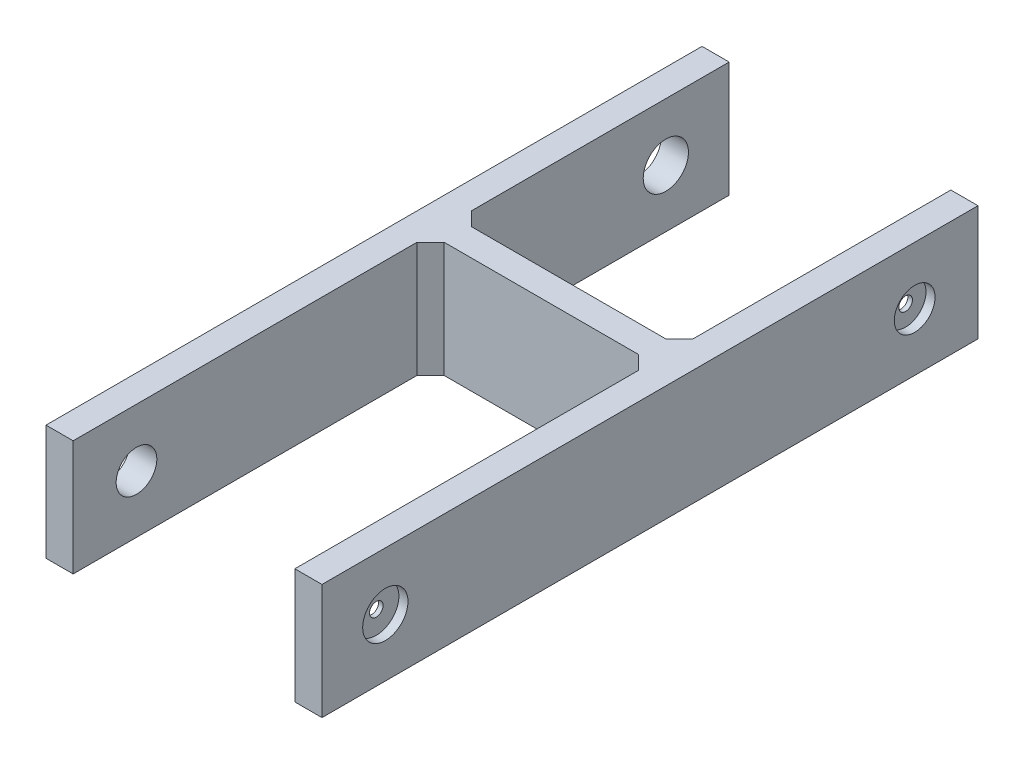
ISO-10303-21;
HEADER;
FILE_DESCRIPTION(('STEP AP214'),'2;1');
FILE_NAME('part.step','',(''),(''),'','','');
FILE_SCHEMA(('AUTOMOTIVE_DESIGN { 1 0 10303 214 1 1 1 1 }'));
ENDSEC;
DATA;
#1=APPLICATION_CONTEXT('core data for automotive mechanical design processes');
#2=APPLICATION_PROTOCOL_DEFINITION('international standard','automotive_design',2000,#1);
#3=PRODUCT_CONTEXT('',#1,'mechanical');
#4=PRODUCT('Part','Part','',(#3));
#5=PRODUCT_RELATED_PRODUCT_CATEGORY('part','',(#4));
#6=PRODUCT_DEFINITION_FORMATION('','',#4);
#7=PRODUCT_DEFINITION_CONTEXT('part definition',#1,'design');
#8=PRODUCT_DEFINITION('design','',#6,#7);
#9=PRODUCT_DEFINITION_SHAPE('','',#8);
#10=(LENGTH_UNIT() NAMED_UNIT(*) SI_UNIT(.MILLI.,.METRE.));
#11=(NAMED_UNIT(*) PLANE_ANGLE_UNIT() SI_UNIT($,.RADIAN.));
#12=(NAMED_UNIT(*) SI_UNIT($,.STERADIAN.) SOLID_ANGLE_UNIT());
#13=UNCERTAINTY_MEASURE_WITH_UNIT(LENGTH_MEASURE(1.E-05),#10,'distance_accuracy_value','');
#14=(GEOMETRIC_REPRESENTATION_CONTEXT(3) GLOBAL_UNCERTAINTY_ASSIGNED_CONTEXT((#13)) GLOBAL_UNIT_ASSIGNED_CONTEXT((#10,
#11,#12)) REPRESENTATION_CONTEXT('',''));
#15=CARTESIAN_POINT('',(0.,0.,0.));
#16=DIRECTION('',(0.,0.,1.));
#17=DIRECTION('',(1.,0.,0.));
#18=AXIS2_PLACEMENT_3D('',#15,#16,#17);
#19=CARTESIAN_POINT('',(65.,12.75,71.));
#20=DIRECTION('',(-1.,0.,0.));
#21=DIRECTION('',(0.,0.,1.));
#22=AXIS2_PLACEMENT_3D('',#19,#20,#21);
#23=CYLINDRICAL_SURFACE('',#22,1.5);
#24=CARTESIAN_POINT('',(58.,12.75,71.));
#25=DIRECTION('',(1.,0.,0.));
#26=DIRECTION('',(0.,0.,-1.));
#27=AXIS2_PLACEMENT_3D('',#24,#25,#26);
#28=CIRCLE('',#27,1.5);
#29=CARTESIAN_POINT('',(58.,12.75,69.5));
#30=VERTEX_POINT('',#29);
#31=EDGE_CURVE('E298',#30,#30,#28,.F.);
#32=ORIENTED_EDGE('',*,*,#31,.T.);
#33=EDGE_LOOP('',(#32));
#34=FACE_BOUND('',#33,.T.);
#35=CARTESIAN_POINT('',(59.,12.75,71.));
#36=DIRECTION('',(1.,0.,0.));
#37=DIRECTION('',(0.,0.,-1.));
#38=AXIS2_PLACEMENT_3D('',#35,#36,#37);
#39=CIRCLE('',#38,1.5);
#40=CARTESIAN_POINT('',(59.,12.75,69.5));
#41=VERTEX_POINT('',#40);
#42=EDGE_CURVE('E312',#41,#41,#39,.F.);
#43=ORIENTED_EDGE('',*,*,#42,.F.);
#44=EDGE_LOOP('',(#43));
#45=FACE_BOUND('',#44,.T.);
#46=ADVANCED_FACE('F41',(#34,#45),#23,.F.);
#47=CARTESIAN_POINT('',(6.00000000000002,25.5,85.));
#48=DIRECTION('',(-1.,0.,0.));
#49=DIRECTION('',(0.,0.,1.));
#50=AXIS2_PLACEMENT_3D('',#47,#48,#49);
#51=PLANE('',#50);
#52=CARTESIAN_POINT('',(6.,12.75,71.));
#53=DIRECTION('',(1.,0.,0.));
#54=DIRECTION('',(0.,0.,-1.));
#55=AXIS2_PLACEMENT_3D('',#52,#53,#54);
#56=CIRCLE('',#55,4.5);
#57=CARTESIAN_POINT('',(6.,12.75,66.5));
#58=VERTEX_POINT('',#57);
#59=EDGE_CURVE('E317',#58,#58,#56,.T.);
#60=ORIENTED_EDGE('',*,*,#59,.F.);
#61=EDGE_LOOP('',(#60));
#62=FACE_BOUND('',#61,.T.);
#63=DIRECTION('',(0.,0.,-1.));
#64=VECTOR('',#63,1.);
#65=CARTESIAN_POINT('',(6.00000000000002,0.,85.));
#66=LINE('',#65,#64);
#67=CARTESIAN_POINT('',(6.00000000000002,0.,85.));
#68=VERTEX_POINT('',#67);
#69=CARTESIAN_POINT('',(6.00000000000001,0.,9.00000000000002));
#70=VERTEX_POINT('',#69);
#71=EDGE_CURVE('E361',#68,#70,#66,.T.);
#72=ORIENTED_EDGE('',*,*,#71,.T.);
#73=DIRECTION('',(0.,1.,0.));
#74=VECTOR('',#73,1.);
#75=CARTESIAN_POINT('',(6.00000000000001,-4.24264068711929,9.00000000000001));
#76=LINE('',#75,#74);
#77=CARTESIAN_POINT('',(6.00000000000001,25.5,9.00000000000002));
#78=VERTEX_POINT('',#77);
#79=EDGE_CURVE('E538',#70,#78,#76,.T.);
#80=ORIENTED_EDGE('',*,*,#79,.T.);
#81=DIRECTION('',(0.,0.,-1.));
#82=VECTOR('',#81,1.);
#83=CARTESIAN_POINT('',(6.00000000000002,25.5,85.));
#84=LINE('',#83,#82);
#85=CARTESIAN_POINT('',(6.00000000000002,25.5,85.));
#86=VERTEX_POINT('',#85);
#87=EDGE_CURVE('E322',#86,#78,#84,.T.);
#88=ORIENTED_EDGE('',*,*,#87,.F.);
#89=DIRECTION('',(0.,-1.,0.));
#90=VECTOR('',#89,1.);
#91=CARTESIAN_POINT('',(6.00000000000002,25.5,85.));
#92=LINE('',#91,#90);
#93=EDGE_CURVE('E360',#86,#68,#92,.T.);
#94=ORIENTED_EDGE('',*,*,#93,.T.);
#95=EDGE_LOOP('',(#72,#80,#88,#94));
#96=FACE_BOUND('',#95,.T.);
#97=ADVANCED_FACE('F43',(#62,#96),#51,.F.);
#98=CARTESIAN_POINT('',(6.00000000000001,25.5,6.00000000000001));
#99=DIRECTION('',(0.,0.,-1.));
#100=DIRECTION('',(-1.,0.,0.));
#101=AXIS2_PLACEMENT_3D('',#98,#99,#100);
#102=PLANE('',#101);
#103=DIRECTION('',(1.,0.,0.));
#104=VECTOR('',#103,1.);
#105=CARTESIAN_POINT('',(6.00000000000001,0.,6.00000000000001));
#106=LINE('',#105,#104);
#107=CARTESIAN_POINT('',(9.00000000000001,0.,6.00000000000001));
#108=VERTEX_POINT('',#107);
#109=CARTESIAN_POINT('',(52.,0.,6.00000000000001));
#110=VERTEX_POINT('',#109);
#111=EDGE_CURVE('E364',#108,#110,#106,.T.);
#112=ORIENTED_EDGE('',*,*,#111,.T.);
#113=DIRECTION('',(0.,1.,0.));
#114=VECTOR('',#113,1.);
#115=CARTESIAN_POINT('',(52.,-4.24264068711929,5.99999999999998));
#116=LINE('',#115,#114);
#117=CARTESIAN_POINT('',(52.,25.5,6.00000000000001));
#118=VERTEX_POINT('',#117);
#119=EDGE_CURVE('E67',#110,#118,#116,.T.);
#120=ORIENTED_EDGE('',*,*,#119,.T.);
#121=DIRECTION('',(1.,0.,0.));
#122=VECTOR('',#121,1.);
#123=CARTESIAN_POINT('',(6.00000000000001,25.5,6.00000000000001));
#124=LINE('',#123,#122);
#125=CARTESIAN_POINT('',(9.00000000000001,25.5,6.00000000000001));
#126=VERTEX_POINT('',#125);
#127=EDGE_CURVE('E326',#126,#118,#124,.T.);
#128=ORIENTED_EDGE('',*,*,#127,.F.);
#129=DIRECTION('',(0.,1.,0.));
#130=VECTOR('',#129,1.);
#131=CARTESIAN_POINT('',(9.00000000000001,-4.24264068711929,6.00000000000001));
#132=LINE('',#131,#130);
#133=EDGE_CURVE('E517',#108,#126,#132,.T.);
#134=ORIENTED_EDGE('',*,*,#133,.F.);
#135=EDGE_LOOP('',(#112,#120,#128,#134));
#136=FACE_BOUND('',#135,.T.);
#137=ADVANCED_FACE('F456',(#136),#102,.F.);
#138=CARTESIAN_POINT('',(55.,25.5,6.00000000000001));
#139=DIRECTION('',(1.,0.,0.));
#140=DIRECTION('',(0.,0.,-1.));
#141=AXIS2_PLACEMENT_3D('',#138,#139,#140);
#142=PLANE('',#141);
#143=DIRECTION('',(0.,-0.201652920670486,-0.979457043256652));
#144=VECTOR('',#143,1.);
#145=CARTESIAN_POINT('',(55.,19.25,71.));
#146=LINE('',#145,#144);
#147=CARTESIAN_POINT('',(55.,19.25,71.));
#148=VERTEX_POINT('',#147);
#149=CARTESIAN_POINT('',(55.,15.75,54.));
#150=VERTEX_POINT('',#149);
#151=EDGE_CURVE('E284',#148,#150,#146,.T.);
#152=ORIENTED_EDGE('',*,*,#151,.F.);
#153=CARTESIAN_POINT('',(55.,12.75,71.));
#154=DIRECTION('',(-1.,0.,0.));
#155=DIRECTION('',(0.,0.,-1.));
#156=AXIS2_PLACEMENT_3D('',#153,#154,#155);
#157=CIRCLE('',#156,6.49999999999999);
#158=CARTESIAN_POINT('',(55.,6.24999999999999,71.));
#159=VERTEX_POINT('',#158);
#160=EDGE_CURVE('E258',#159,#148,#157,.T.);
#161=ORIENTED_EDGE('',*,*,#160,.F.);
#162=DIRECTION('',(0.,-0.201652920670488,0.979457043256652));
#163=VECTOR('',#162,1.);
#164=CARTESIAN_POINT('',(55.,9.75,54.));
#165=LINE('',#164,#163);
#166=CARTESIAN_POINT('',(55.,9.75,54.));
#167=VERTEX_POINT('',#166);
#168=EDGE_CURVE('E269',#167,#159,#165,.T.);
#169=ORIENTED_EDGE('',*,*,#168,.F.);
#170=CARTESIAN_POINT('',(55.,12.75,54.));
#171=DIRECTION('',(-1.,0.,0.));
#172=DIRECTION('',(0.,0.,1.));
#173=AXIS2_PLACEMENT_3D('',#170,#171,#172);
#174=CIRCLE('',#173,3.);
#175=EDGE_CURVE('E288',#150,#167,#174,.T.);
#176=ORIENTED_EDGE('',*,*,#175,.F.);
#177=EDGE_LOOP('',(#152,#161,#169,#176));
#178=FACE_BOUND('',#177,.T.);
#179=DIRECTION('',(0.,0.,1.));
#180=VECTOR('',#179,1.);
#181=CARTESIAN_POINT('',(55.,25.5,6.00000000000001));
#182=LINE('',#181,#180);
#183=CARTESIAN_POINT('',(55.,25.5,8.99999999999998));
#184=VERTEX_POINT('',#183);
#185=CARTESIAN_POINT('',(55.,25.5,85.));
#186=VERTEX_POINT('',#185);
#187=EDGE_CURVE('E59',#184,#186,#182,.T.);
#188=ORIENTED_EDGE('',*,*,#187,.F.);
#189=DIRECTION('',(0.,1.,0.));
#190=VECTOR('',#189,1.);
#191=CARTESIAN_POINT('',(55.,-4.24264068711929,8.99999999999998));
#192=LINE('',#191,#190);
#193=CARTESIAN_POINT('',(55.,0.,8.99999999999998));
#194=VERTEX_POINT('',#193);
#195=EDGE_CURVE('E526',#194,#184,#192,.T.);
#196=ORIENTED_EDGE('',*,*,#195,.F.);
#197=DIRECTION('',(0.,0.,1.));
#198=VECTOR('',#197,1.);
#199=CARTESIAN_POINT('',(55.,0.,6.00000000000001));
#200=LINE('',#199,#198);
#201=CARTESIAN_POINT('',(55.,0.,85.));
#202=VERTEX_POINT('',#201);
#203=EDGE_CURVE('E367',#194,#202,#200,.T.);
#204=ORIENTED_EDGE('',*,*,#203,.T.);
#205=DIRECTION('',(0.,-1.,0.));
#206=VECTOR('',#205,1.);
#207=CARTESIAN_POINT('',(55.,25.5,85.));
#208=LINE('',#207,#206);
#209=EDGE_CURVE('E11',#186,#202,#208,.T.);
#210=ORIENTED_EDGE('',*,*,#209,.F.);
#211=EDGE_LOOP('',(#188,#196,#204,#210));
#212=FACE_BOUND('',#211,.T.);
#213=ADVANCED_FACE('F507',(#178,#212),#142,.F.);
#214=CARTESIAN_POINT('',(55.,25.5,85.));
#215=DIRECTION('',(0.,0.,-1.));
#216=DIRECTION('',(-1.,0.,0.));
#217=AXIS2_PLACEMENT_3D('',#214,#215,#216);
#218=PLANE('',#217);
#219=DIRECTION('',(1.,0.,0.));
#220=VECTOR('',#219,1.);
#221=CARTESIAN_POINT('',(55.,0.,85.));
#222=LINE('',#221,#220);
#223=CARTESIAN_POINT('',(61.,0.,85.));
#224=VERTEX_POINT('',#223);
#225=EDGE_CURVE('E370',#202,#224,#222,.T.);
#226=ORIENTED_EDGE('',*,*,#225,.T.);
#227=DIRECTION('',(0.,-1.,0.));
#228=VECTOR('',#227,1.);
#229=CARTESIAN_POINT('',(61.,25.5,85.));
#230=LINE('',#229,#228);
#231=CARTESIAN_POINT('',(61.,25.5,85.));
#232=VERTEX_POINT('',#231);
#233=EDGE_CURVE('E51',#232,#224,#230,.T.);
#234=ORIENTED_EDGE('',*,*,#233,.F.);
#235=DIRECTION('',(1.,0.,0.));
#236=VECTOR('',#235,1.);
#237=CARTESIAN_POINT('',(55.,25.5,85.));
#238=LINE('',#237,#236);
#239=EDGE_CURVE('E332',#186,#232,#238,.T.);
#240=ORIENTED_EDGE('',*,*,#239,.F.);
#241=ORIENTED_EDGE('',*,*,#209,.T.);
#242=EDGE_LOOP('',(#226,#234,#240,#241));
#243=FACE_BOUND('',#242,.T.);
#244=ADVANCED_FACE('F503',(#243),#218,.F.);
#245=CARTESIAN_POINT('',(61.,25.5,85.));
#246=DIRECTION('',(-1.,0.,0.));
#247=DIRECTION('',(0.,0.,1.));
#248=AXIS2_PLACEMENT_3D('',#245,#246,#247);
#249=PLANE('',#248);
#250=CARTESIAN_POINT('',(61.,12.75,-46.));
#251=DIRECTION('',(1.,0.,0.));
#252=DIRECTION('',(0.,0.,-1.));
#253=AXIS2_PLACEMENT_3D('',#250,#251,#252);
#254=CIRCLE('',#253,4.5);
#255=CARTESIAN_POINT('',(61.,12.75,-50.5));
#256=VERTEX_POINT('',#255);
#257=EDGE_CURVE('E239',#256,#256,#254,.T.);
#258=ORIENTED_EDGE('',*,*,#257,.F.);
#259=EDGE_LOOP('',(#258));
#260=FACE_BOUND('',#259,.T.);
#261=CARTESIAN_POINT('',(61.,12.75,71.));
#262=DIRECTION('',(1.,0.,0.));
#263=DIRECTION('',(0.,0.,-1.));
#264=AXIS2_PLACEMENT_3D('',#261,#262,#263);
#265=CIRCLE('',#264,5.);
#266=CARTESIAN_POINT('',(61.,12.75,66.));
#267=VERTEX_POINT('',#266);
#268=EDGE_CURVE('E313',#267,#267,#265,.T.);
#269=ORIENTED_EDGE('',*,*,#268,.F.);
#270=EDGE_LOOP('',(#269));
#271=FACE_BOUND('',#270,.T.);
#272=DIRECTION('',(0.,0.,-1.));
#273=VECTOR('',#272,1.);
#274=CARTESIAN_POINT('',(61.,0.,85.));
#275=LINE('',#274,#273);
#276=CARTESIAN_POINT('',(61.,0.,-60.));
#277=VERTEX_POINT('',#276);
#278=EDGE_CURVE('E373',#224,#277,#275,.T.);
#279=ORIENTED_EDGE('',*,*,#278,.T.);
#280=DIRECTION('',(0.,-1.,0.));
#281=VECTOR('',#280,1.);
#282=CARTESIAN_POINT('',(61.,25.5,-60.));
#283=LINE('',#282,#281);
#284=CARTESIAN_POINT('',(61.,25.5,-60.));
#285=VERTEX_POINT('',#284);
#286=EDGE_CURVE('E415',#285,#277,#283,.T.);
#287=ORIENTED_EDGE('',*,*,#286,.F.);
#288=DIRECTION('',(0.,0.,-1.));
#289=VECTOR('',#288,1.);
#290=CARTESIAN_POINT('',(61.,25.5,85.));
#291=LINE('',#290,#289);
#292=EDGE_CURVE('E335',#232,#285,#291,.T.);
#293=ORIENTED_EDGE('',*,*,#292,.F.);
#294=ORIENTED_EDGE('',*,*,#233,.T.);
#295=EDGE_LOOP('',(#279,#287,#293,#294));
#296=FACE_BOUND('',#295,.T.);
#297=ADVANCED_FACE('F499',(#260,#271,#296),#249,.F.);
#298=CARTESIAN_POINT('',(55.,25.5,-60.));
#299=DIRECTION('',(0.,0.,1.));
#300=DIRECTION('',(1.,0.,0.));
#301=AXIS2_PLACEMENT_3D('',#298,#299,#300);
#302=PLANE('',#301);
#303=DIRECTION('',(-1.,0.,0.));
#304=VECTOR('',#303,1.);
#305=CARTESIAN_POINT('',(55.,0.,-60.));
#306=LINE('',#305,#304);
#307=CARTESIAN_POINT('',(55.,0.,-60.));
#308=VERTEX_POINT('',#307);
#309=EDGE_CURVE('E376',#277,#308,#306,.T.);
#310=ORIENTED_EDGE('',*,*,#309,.T.);
#311=DIRECTION('',(0.,-1.,0.));
#312=VECTOR('',#311,1.);
#313=CARTESIAN_POINT('',(55.,25.5,-60.));
#314=LINE('',#313,#312);
#315=CARTESIAN_POINT('',(55.,25.5,-60.));
#316=VERTEX_POINT('',#315);
#317=EDGE_CURVE('E411',#316,#308,#314,.T.);
#318=ORIENTED_EDGE('',*,*,#317,.F.);
#319=DIRECTION('',(-1.,0.,0.));
#320=VECTOR('',#319,1.);
#321=CARTESIAN_POINT('',(55.,25.5,-60.));
#322=LINE('',#321,#320);
#323=EDGE_CURVE('E338',#285,#316,#322,.T.);
#324=ORIENTED_EDGE('',*,*,#323,.F.);
#325=ORIENTED_EDGE('',*,*,#286,.T.);
#326=EDGE_LOOP('',(#310,#318,#324,#325));
#327=FACE_BOUND('',#326,.T.);
#328=ADVANCED_FACE('F495',(#327),#302,.F.);
#329=CARTESIAN_POINT('',(55.,25.5,0.));
#330=DIRECTION('',(1.,0.,0.));
#331=DIRECTION('',(0.,0.,-1.));
#332=AXIS2_PLACEMENT_3D('',#329,#330,#331);
#333=PLANE('',#332);
#334=DIRECTION('',(0.,0.201652920670488,-0.979457043256652));
#335=VECTOR('',#334,1.);
#336=CARTESIAN_POINT('',(55.,19.25,-46.));
#337=LINE('',#336,#335);
#338=CARTESIAN_POINT('',(55.,15.75,-29.));
#339=VERTEX_POINT('',#338);
#340=CARTESIAN_POINT('',(55.,19.25,-46.));
#341=VERTEX_POINT('',#340);
#342=EDGE_CURVE('E248',#339,#341,#337,.T.);
#343=ORIENTED_EDGE('',*,*,#342,.F.);
#344=CARTESIAN_POINT('',(55.,12.75,-29.));
#345=DIRECTION('',(-1.,0.,0.));
#346=DIRECTION('',(0.,0.,-1.));
#347=AXIS2_PLACEMENT_3D('',#344,#345,#346);
#348=CIRCLE('',#347,3.);
#349=CARTESIAN_POINT('',(55.,9.75,-29.));
#350=VERTEX_POINT('',#349);
#351=EDGE_CURVE('E212',#350,#339,#348,.T.);
#352=ORIENTED_EDGE('',*,*,#351,.F.);
#353=DIRECTION('',(0.,0.201652920670488,0.979457043256651));
#354=VECTOR('',#353,1.);
#355=CARTESIAN_POINT('',(55.,9.75,-29.));
#356=LINE('',#355,#354);
#357=CARTESIAN_POINT('',(55.,6.24999999999999,-46.));
#358=VERTEX_POINT('',#357);
#359=EDGE_CURVE('E232',#358,#350,#356,.T.);
#360=ORIENTED_EDGE('',*,*,#359,.F.);
#361=CARTESIAN_POINT('',(55.,12.75,-46.));
#362=DIRECTION('',(-1.,0.,0.));
#363=DIRECTION('',(0.,0.,1.));
#364=AXIS2_PLACEMENT_3D('',#361,#362,#363);
#365=CIRCLE('',#364,6.50000000000001);
#366=EDGE_CURVE('E236',#341,#358,#365,.T.);
#367=ORIENTED_EDGE('',*,*,#366,.F.);
#368=EDGE_LOOP('',(#343,#352,#360,#367));
#369=FACE_BOUND('',#368,.T.);
#370=DIRECTION('',(0.,0.,1.));
#371=VECTOR('',#370,1.);
#372=CARTESIAN_POINT('',(55.,0.,0.));
#373=LINE('',#372,#371);
#374=CARTESIAN_POINT('',(55.,0.,-3.00000000000004));
#375=VERTEX_POINT('',#374);
#376=EDGE_CURVE('E379',#308,#375,#373,.T.);
#377=ORIENTED_EDGE('',*,*,#376,.T.);
#378=DIRECTION('',(0.,1.,0.));
#379=VECTOR('',#378,1.);
#380=CARTESIAN_POINT('',(55.,-4.24264068711929,-3.00000000000003));
#381=LINE('',#380,#379);
#382=CARTESIAN_POINT('',(55.,25.5,-3.00000000000004));
#383=VERTEX_POINT('',#382);
#384=EDGE_CURVE('E553',#375,#383,#381,.T.);
#385=ORIENTED_EDGE('',*,*,#384,.T.);
#386=DIRECTION('',(0.,0.,1.));
#387=VECTOR('',#386,1.);
#388=CARTESIAN_POINT('',(55.,25.5,0.));
#389=LINE('',#388,#387);
#390=EDGE_CURVE('E341',#316,#383,#389,.T.);
#391=ORIENTED_EDGE('',*,*,#390,.F.);
#392=ORIENTED_EDGE('',*,*,#317,.T.);
#393=EDGE_LOOP('',(#377,#385,#391,#392));
#394=FACE_BOUND('',#393,.T.);
#395=ADVANCED_FACE('F491',(#369,#394),#333,.F.);
#396=CARTESIAN_POINT('',(6.00000000000001,25.5,0.));
#397=DIRECTION('',(0.,0.,1.));
#398=DIRECTION('',(1.,0.,0.));
#399=AXIS2_PLACEMENT_3D('',#396,#397,#398);
#400=PLANE('',#399);
#401=DIRECTION('',(-1.,0.,0.));
#402=VECTOR('',#401,1.);
#403=CARTESIAN_POINT('',(6.00000000000001,25.5,0.));
#404=LINE('',#403,#402);
#405=CARTESIAN_POINT('',(52.,25.5,0.));
#406=VERTEX_POINT('',#405);
#407=CARTESIAN_POINT('',(9.00000000000001,25.5,0.));
#408=VERTEX_POINT('',#407);
#409=EDGE_CURVE('E345',#406,#408,#404,.T.);
#410=ORIENTED_EDGE('',*,*,#409,.F.);
#411=DIRECTION('',(0.,1.,0.));
#412=VECTOR('',#411,1.);
#413=CARTESIAN_POINT('',(52.,-4.24264068711929,0.));
#414=LINE('',#413,#412);
#415=CARTESIAN_POINT('',(52.,0.,0.));
#416=VERTEX_POINT('',#415);
#417=EDGE_CURVE('E558',#416,#406,#414,.T.);
#418=ORIENTED_EDGE('',*,*,#417,.F.);
#419=DIRECTION('',(-1.,0.,0.));
#420=VECTOR('',#419,1.);
#421=CARTESIAN_POINT('',(6.00000000000001,0.,0.));
#422=LINE('',#421,#420);
#423=CARTESIAN_POINT('',(9.00000000000001,0.,0.));
#424=VERTEX_POINT('',#423);
#425=EDGE_CURVE('E382',#416,#424,#422,.T.);
#426=ORIENTED_EDGE('',*,*,#425,.T.);
#427=DIRECTION('',(0.,1.,0.));
#428=VECTOR('',#427,1.);
#429=CARTESIAN_POINT('',(9.00000000000001,-4.24264068711929,0.));
#430=LINE('',#429,#428);
#431=EDGE_CURVE('E576',#424,#408,#430,.T.);
#432=ORIENTED_EDGE('',*,*,#431,.T.);
#433=EDGE_LOOP('',(#410,#418,#426,#432));
#434=FACE_BOUND('',#433,.T.);
#435=ADVANCED_FACE('F487',(#434),#400,.F.);
#436=CARTESIAN_POINT('',(6.,25.5,-60.));
#437=DIRECTION('',(-1.,0.,0.));
#438=DIRECTION('',(0.,0.,1.));
#439=AXIS2_PLACEMENT_3D('',#436,#437,#438);
#440=PLANE('',#439);
#441=CARTESIAN_POINT('',(6.00000000000001,12.75,-46.));
#442=DIRECTION('',(-1.,0.,0.));
#443=DIRECTION('',(0.,0.,1.));
#444=AXIS2_PLACEMENT_3D('',#441,#442,#443);
#445=CIRCLE('',#444,5.);
#446=CARTESIAN_POINT('',(6.00000000000001,12.75,-41.));
#447=VERTEX_POINT('',#446);
#448=EDGE_CURVE('E584',#447,#447,#445,.T.);
#449=ORIENTED_EDGE('',*,*,#448,.T.);
#450=EDGE_LOOP('',(#449));
#451=FACE_BOUND('',#450,.T.);
#452=DIRECTION('',(0.,0.,-1.));
#453=VECTOR('',#452,1.);
#454=CARTESIAN_POINT('',(6.,25.5,-60.));
#455=LINE('',#454,#453);
#456=CARTESIAN_POINT('',(6.00000000000001,25.5,-3.));
#457=VERTEX_POINT('',#456);
#458=CARTESIAN_POINT('',(6.,25.5,-60.));
#459=VERTEX_POINT('',#458);
#460=EDGE_CURVE('E348',#457,#459,#455,.T.);
#461=ORIENTED_EDGE('',*,*,#460,.F.);
#462=DIRECTION('',(0.,1.,0.));
#463=VECTOR('',#462,1.);
#464=CARTESIAN_POINT('',(6.00000000000001,-4.24264068711929,-3.));
#465=LINE('',#464,#463);
#466=CARTESIAN_POINT('',(6.00000000000001,0.,-3.));
#467=VERTEX_POINT('',#466);
#468=EDGE_CURVE('E572',#467,#457,#465,.T.);
#469=ORIENTED_EDGE('',*,*,#468,.F.);
#470=DIRECTION('',(0.,0.,-1.));
#471=VECTOR('',#470,1.);
#472=CARTESIAN_POINT('',(6.,0.,-60.));
#473=LINE('',#472,#471);
#474=CARTESIAN_POINT('',(6.,0.,-60.));
#475=VERTEX_POINT('',#474);
#476=EDGE_CURVE('E385',#467,#475,#473,.T.);
#477=ORIENTED_EDGE('',*,*,#476,.T.);
#478=DIRECTION('',(0.,-1.,0.));
#479=VECTOR('',#478,1.);
#480=CARTESIAN_POINT('',(6.,25.5,-60.));
#481=LINE('',#480,#479);
#482=EDGE_CURVE('E407',#459,#475,#481,.T.);
#483=ORIENTED_EDGE('',*,*,#482,.F.);
#484=EDGE_LOOP('',(#461,#469,#477,#483));
#485=FACE_BOUND('',#484,.T.);
#486=ADVANCED_FACE('F483',(#451,#485),#440,.F.);
#487=CARTESIAN_POINT('',(0.,25.5,-60.));
#488=DIRECTION('',(0.,0.,1.));
#489=DIRECTION('',(1.,0.,0.));
#490=AXIS2_PLACEMENT_3D('',#487,#488,#489);
#491=PLANE('',#490);
#492=DIRECTION('',(-1.,0.,0.));
#493=VECTOR('',#492,1.);
#494=CARTESIAN_POINT('',(0.,0.,-60.));
#495=LINE('',#494,#493);
#496=CARTESIAN_POINT('',(0.,0.,-60.));
#497=VERTEX_POINT('',#496);
#498=EDGE_CURVE('E388',#475,#497,#495,.T.);
#499=ORIENTED_EDGE('',*,*,#498,.T.);
#500=DIRECTION('',(0.,-1.,0.));
#501=VECTOR('',#500,1.);
#502=CARTESIAN_POINT('',(0.,25.5,-60.));
#503=LINE('',#502,#501);
#504=CARTESIAN_POINT('',(0.,25.5,-60.));
#505=VERTEX_POINT('',#504);
#506=EDGE_CURVE('E403',#505,#497,#503,.T.);
#507=ORIENTED_EDGE('',*,*,#506,.F.);
#508=DIRECTION('',(-1.,0.,0.));
#509=VECTOR('',#508,1.);
#510=CARTESIAN_POINT('',(0.,25.5,-60.));
#511=LINE('',#510,#509);
#512=EDGE_CURVE('E351',#459,#505,#511,.T.);
#513=ORIENTED_EDGE('',*,*,#512,.F.);
#514=ORIENTED_EDGE('',*,*,#482,.T.);
#515=EDGE_LOOP('',(#499,#507,#513,#514));
#516=FACE_BOUND('',#515,.T.);
#517=ADVANCED_FACE('F479',(#516),#491,.F.);
#518=CARTESIAN_POINT('',(0.,25.5,-60.));
#519=DIRECTION('',(1.,0.,0.));
#520=DIRECTION('',(0.,0.,-1.));
#521=AXIS2_PLACEMENT_3D('',#518,#519,#520);
#522=PLANE('',#521);
#523=CARTESIAN_POINT('',(0.,12.75,-46.));
#524=DIRECTION('',(-1.,0.,0.));
#525=DIRECTION('',(0.,0.,1.));
#526=AXIS2_PLACEMENT_3D('',#523,#524,#525);
#527=CIRCLE('',#526,5.);
#528=CARTESIAN_POINT('',(0.,12.75,-41.));
#529=VERTEX_POINT('',#528);
#530=EDGE_CURVE('E580',#529,#529,#527,.T.);
#531=ORIENTED_EDGE('',*,*,#530,.F.);
#532=EDGE_LOOP('',(#531));
#533=FACE_BOUND('',#532,.T.);
#534=CARTESIAN_POINT('',(0.,12.75,71.));
#535=DIRECTION('',(1.,0.,0.));
#536=DIRECTION('',(0.,0.,-1.));
#537=AXIS2_PLACEMENT_3D('',#534,#535,#536);
#538=CIRCLE('',#537,4.5);
#539=CARTESIAN_POINT('',(0.,12.75,66.5));
#540=VERTEX_POINT('',#539);
#541=EDGE_CURVE('E321',#540,#540,#538,.T.);
#542=ORIENTED_EDGE('',*,*,#541,.T.);
#543=EDGE_LOOP('',(#542));
#544=FACE_BOUND('',#543,.T.);
#545=DIRECTION('',(0.,0.,1.));
#546=VECTOR('',#545,1.);
#547=CARTESIAN_POINT('',(0.,0.,-60.));
#548=LINE('',#547,#546);
#549=CARTESIAN_POINT('',(0.,0.,85.));
#550=VERTEX_POINT('',#549);
#551=EDGE_CURVE('E391',#497,#550,#548,.T.);
#552=ORIENTED_EDGE('',*,*,#551,.T.);
#553=DIRECTION('',(0.,-1.,0.));
#554=VECTOR('',#553,1.);
#555=CARTESIAN_POINT('',(0.,25.5,85.));
#556=LINE('',#555,#554);
#557=CARTESIAN_POINT('',(0.,25.5,85.));
#558=VERTEX_POINT('',#557);
#559=EDGE_CURVE('E399',#558,#550,#556,.T.);
#560=ORIENTED_EDGE('',*,*,#559,.F.);
#561=DIRECTION('',(0.,0.,1.));
#562=VECTOR('',#561,1.);
#563=CARTESIAN_POINT('',(0.,25.5,-60.));
#564=LINE('',#563,#562);
#565=EDGE_CURVE('E354',#505,#558,#564,.T.);
#566=ORIENTED_EDGE('',*,*,#565,.F.);
#567=ORIENTED_EDGE('',*,*,#506,.T.);
#568=EDGE_LOOP('',(#552,#560,#566,#567));
#569=FACE_BOUND('',#568,.T.);
#570=ADVANCED_FACE('F475',(#533,#544,#569),#522,.F.);
#571=CARTESIAN_POINT('',(0.,25.5,85.));
#572=DIRECTION('',(0.,0.,-1.));
#573=DIRECTION('',(-1.,0.,0.));
#574=AXIS2_PLACEMENT_3D('',#571,#572,#573);
#575=PLANE('',#574);
#576=DIRECTION('',(1.,0.,0.));
#577=VECTOR('',#576,1.);
#578=CARTESIAN_POINT('',(0.,0.,85.));
#579=LINE('',#578,#577);
#580=EDGE_CURVE('E327',#550,#68,#579,.T.);
#581=ORIENTED_EDGE('',*,*,#580,.T.);
#582=ORIENTED_EDGE('',*,*,#93,.F.);
#583=DIRECTION('',(1.,0.,0.));
#584=VECTOR('',#583,1.);
#585=CARTESIAN_POINT('',(0.,25.5,85.));
#586=LINE('',#585,#584);
#587=EDGE_CURVE('E357',#558,#86,#586,.T.);
#588=ORIENTED_EDGE('',*,*,#587,.F.);
#589=ORIENTED_EDGE('',*,*,#559,.T.);
#590=EDGE_LOOP('',(#581,#582,#588,#589));
#591=FACE_BOUND('',#590,.T.);
#592=ADVANCED_FACE('F468',(#591),#575,.F.);
#593=CARTESIAN_POINT('',(0.,25.5,0.));
#594=DIRECTION('',(0.,-1.,0.));
#595=DIRECTION('',(0.,0.,-1.));
#596=AXIS2_PLACEMENT_3D('',#593,#594,#595);
#597=PLANE('',#596);
#598=DIRECTION('',(0.707106781186548,0.,0.707106781186547));
#599=VECTOR('',#598,1.);
#600=CARTESIAN_POINT('',(55.,25.5,8.99999999999998));
#601=LINE('',#600,#599);
#602=EDGE_CURVE('E527',#118,#184,#601,.T.);
#603=ORIENTED_EDGE('',*,*,#602,.T.);
#604=ORIENTED_EDGE('',*,*,#187,.T.);
#605=ORIENTED_EDGE('',*,*,#239,.T.);
#606=ORIENTED_EDGE('',*,*,#292,.T.);
#607=ORIENTED_EDGE('',*,*,#323,.T.);
#608=ORIENTED_EDGE('',*,*,#390,.T.);
#609=DIRECTION('',(-0.707106781186545,0.,0.70710678118655));
#610=VECTOR('',#609,1.);
#611=CARTESIAN_POINT('',(55.,25.5,-3.00000000000003));
#612=LINE('',#611,#610);
#613=EDGE_CURVE('E549',#383,#406,#612,.T.);
#614=ORIENTED_EDGE('',*,*,#613,.T.);
#615=ORIENTED_EDGE('',*,*,#409,.T.);
#616=DIRECTION('',(-0.707106781186547,0.,-0.707106781186548));
#617=VECTOR('',#616,1.);
#618=CARTESIAN_POINT('',(6.00000000000001,25.5,-3.));
#619=LINE('',#618,#617);
#620=EDGE_CURVE('E564',#408,#457,#619,.T.);
#621=ORIENTED_EDGE('',*,*,#620,.T.);
#622=ORIENTED_EDGE('',*,*,#460,.T.);
#623=ORIENTED_EDGE('',*,*,#512,.T.);
#624=ORIENTED_EDGE('',*,*,#565,.T.);
#625=ORIENTED_EDGE('',*,*,#587,.T.);
#626=ORIENTED_EDGE('',*,*,#87,.T.);
#627=DIRECTION('',(0.707106781186547,0.,-0.707106781186548));
#628=VECTOR('',#627,1.);
#629=CARTESIAN_POINT('',(6.00000000000001,25.5,9.00000000000001));
#630=LINE('',#629,#628);
#631=EDGE_CURVE('E533',#78,#126,#630,.T.);
#632=ORIENTED_EDGE('',*,*,#631,.T.);
#633=ORIENTED_EDGE('',*,*,#127,.T.);
#634=EDGE_LOOP('',(#603,#604,#605,#606,#607,#608,#614,#615,#621,#622,#623,#624,#625,#626,#632,#633));
#635=FACE_BOUND('',#634,.T.);
#636=ADVANCED_FACE('F465',(#635),#597,.F.);
#637=CARTESIAN_POINT('',(0.,0.,0.));
#638=DIRECTION('',(0.,-1.,0.));
#639=DIRECTION('',(0.,0.,-1.));
#640=AXIS2_PLACEMENT_3D('',#637,#638,#639);
#641=PLANE('',#640);
#642=ORIENTED_EDGE('',*,*,#203,.F.);
#643=DIRECTION('',(0.707106781186548,0.,0.707106781186547));
#644=VECTOR('',#643,1.);
#645=CARTESIAN_POINT('',(55.,0.,8.99999999999998));
#646=LINE('',#645,#644);
#647=EDGE_CURVE('E522',#110,#194,#646,.T.);
#648=ORIENTED_EDGE('',*,*,#647,.F.);
#649=ORIENTED_EDGE('',*,*,#111,.F.);
#650=DIRECTION('',(0.707106781186547,0.,-0.707106781186548));
#651=VECTOR('',#650,1.);
#652=CARTESIAN_POINT('',(6.00000000000001,0.,9.00000000000001));
#653=LINE('',#652,#651);
#654=EDGE_CURVE('E542',#70,#108,#653,.T.);
#655=ORIENTED_EDGE('',*,*,#654,.F.);
#656=ORIENTED_EDGE('',*,*,#71,.F.);
#657=ORIENTED_EDGE('',*,*,#580,.F.);
#658=ORIENTED_EDGE('',*,*,#551,.F.);
#659=ORIENTED_EDGE('',*,*,#498,.F.);
#660=ORIENTED_EDGE('',*,*,#476,.F.);
#661=DIRECTION('',(-0.707106781186547,0.,-0.707106781186548));
#662=VECTOR('',#661,1.);
#663=CARTESIAN_POINT('',(6.00000000000001,0.,-3.));
#664=LINE('',#663,#662);
#665=EDGE_CURVE('E568',#424,#467,#664,.T.);
#666=ORIENTED_EDGE('',*,*,#665,.F.);
#667=ORIENTED_EDGE('',*,*,#425,.F.);
#668=DIRECTION('',(-0.707106781186545,0.,0.70710678118655));
#669=VECTOR('',#668,1.);
#670=CARTESIAN_POINT('',(55.,0.,-3.00000000000003));
#671=LINE('',#670,#669);
#672=EDGE_CURVE('E554',#375,#416,#671,.T.);
#673=ORIENTED_EDGE('',*,*,#672,.F.);
#674=ORIENTED_EDGE('',*,*,#376,.F.);
#675=ORIENTED_EDGE('',*,*,#309,.F.);
#676=ORIENTED_EDGE('',*,*,#278,.F.);
#677=ORIENTED_EDGE('',*,*,#225,.F.);
#678=EDGE_LOOP('',(#642,#648,#649,#655,#656,#657,#658,#659,#660,#666,#667,#673,#674,#675,#676,#677));
#679=FACE_BOUND('',#678,.T.);
#680=ADVANCED_FACE('F463',(#679),#641,.T.);
#681=CARTESIAN_POINT('',(-19.,12.75,71.));
#682=DIRECTION('',(1.,0.,0.));
#683=DIRECTION('',(0.,0.,-1.));
#684=AXIS2_PLACEMENT_3D('',#681,#682,#683);
#685=CYLINDRICAL_SURFACE('',#684,4.5);
#686=ORIENTED_EDGE('',*,*,#59,.T.);
#687=EDGE_LOOP('',(#686));
#688=FACE_BOUND('',#687,.T.);
#689=ORIENTED_EDGE('',*,*,#541,.F.);
#690=EDGE_LOOP('',(#689));
#691=FACE_BOUND('',#690,.T.);
#692=ADVANCED_FACE('F460',(#688,#691),#685,.F.);
#693=CARTESIAN_POINT('',(59.,12.75,71.));
#694=DIRECTION('',(1.,0.,0.));
#695=DIRECTION('',(0.,0.,-1.));
#696=AXIS2_PLACEMENT_3D('',#693,#694,#695);
#697=PLANE('',#696);
#698=CARTESIAN_POINT('',(59.,12.75,71.));
#699=DIRECTION('',(1.,0.,0.));
#700=DIRECTION('',(0.,0.,-1.));
#701=AXIS2_PLACEMENT_3D('',#698,#699,#700);
#702=CIRCLE('',#701,5.);
#703=CARTESIAN_POINT('',(59.,12.75,66.));
#704=VERTEX_POINT('',#703);
#705=EDGE_CURVE('E308',#704,#704,#702,.T.);
#706=ORIENTED_EDGE('',*,*,#705,.T.);
#707=EDGE_LOOP('',(#706));
#708=FACE_BOUND('',#707,.T.);
#709=ORIENTED_EDGE('',*,*,#42,.T.);
#710=EDGE_LOOP('',(#709));
#711=FACE_BOUND('',#710,.T.);
#712=ADVANCED_FACE('F446',(#708,#711),#697,.T.);
#713=CARTESIAN_POINT('',(59.,12.75,71.));
#714=DIRECTION('',(1.,0.,0.));
#715=DIRECTION('',(0.,0.,-1.));
#716=AXIS2_PLACEMENT_3D('',#713,#714,#715);
#717=CYLINDRICAL_SURFACE('',#716,5.);
#718=ORIENTED_EDGE('',*,*,#705,.F.);
#719=EDGE_LOOP('',(#718));
#720=FACE_BOUND('',#719,.T.);
#721=ORIENTED_EDGE('',*,*,#268,.T.);
#722=EDGE_LOOP('',(#721));
#723=FACE_BOUND('',#722,.T.);
#724=ADVANCED_FACE('F436',(#720,#723),#717,.F.);
#725=CARTESIAN_POINT('',(58.,12.75,71.));
#726=DIRECTION('',(1.,0.,0.));
#727=DIRECTION('',(0.,0.,-1.));
#728=AXIS2_PLACEMENT_3D('',#725,#726,#727);
#729=PLANE('',#728);
#730=CARTESIAN_POINT('',(58.,12.75,71.));
#731=DIRECTION('',(-1.,0.,0.));
#732=DIRECTION('',(0.,0.,-1.));
#733=AXIS2_PLACEMENT_3D('',#730,#731,#732);
#734=CIRCLE('',#733,6.49999999999999);
#735=CARTESIAN_POINT('',(58.,6.24999999999999,71.));
#736=VERTEX_POINT('',#735);
#737=CARTESIAN_POINT('',(58.,19.25,71.));
#738=VERTEX_POINT('',#737);
#739=EDGE_CURVE('E264',#736,#738,#734,.T.);
#740=ORIENTED_EDGE('',*,*,#739,.T.);
#741=DIRECTION('',(0.,-0.201652920670486,-0.979457043256652));
#742=VECTOR('',#741,1.);
#743=CARTESIAN_POINT('',(58.,19.25,71.));
#744=LINE('',#743,#742);
#745=CARTESIAN_POINT('',(58.,15.75,54.));
#746=VERTEX_POINT('',#745);
#747=EDGE_CURVE('E268',#738,#746,#744,.T.);
#748=ORIENTED_EDGE('',*,*,#747,.T.);
#749=CARTESIAN_POINT('',(58.,12.75,54.));
#750=DIRECTION('',(-1.,0.,0.));
#751=DIRECTION('',(0.,0.,1.));
#752=AXIS2_PLACEMENT_3D('',#749,#750,#751);
#753=CIRCLE('',#752,3.);
#754=CARTESIAN_POINT('',(58.,9.75,54.));
#755=VERTEX_POINT('',#754);
#756=EDGE_CURVE('E273',#746,#755,#753,.T.);
#757=ORIENTED_EDGE('',*,*,#756,.T.);
#758=DIRECTION('',(0.,-0.201652920670488,0.979457043256652));
#759=VECTOR('',#758,1.);
#760=CARTESIAN_POINT('',(58.,9.75,54.));
#761=LINE('',#760,#759);
#762=EDGE_CURVE('E277',#755,#736,#761,.T.);
#763=ORIENTED_EDGE('',*,*,#762,.T.);
#764=EDGE_LOOP('',(#740,#748,#757,#763));
#765=FACE_BOUND('',#764,.T.);
#766=ORIENTED_EDGE('',*,*,#31,.F.);
#767=EDGE_LOOP('',(#766));
#768=FACE_BOUND('',#767,.T.);
#769=ADVANCED_FACE('F433',(#765,#768),#729,.F.);
#770=CARTESIAN_POINT('',(58.,12.75,71.));
#771=DIRECTION('',(-1.,0.,0.));
#772=DIRECTION('',(0.,0.,1.));
#773=AXIS2_PLACEMENT_3D('',#770,#771,#772);
#774=CYLINDRICAL_SURFACE('',#773,6.49999999999999);
#775=ORIENTED_EDGE('',*,*,#160,.T.);
#776=DIRECTION('',(-1.,0.,0.));
#777=VECTOR('',#776,1.);
#778=CARTESIAN_POINT('',(58.,19.25,71.));
#779=LINE('',#778,#777);
#780=EDGE_CURVE('E281',#738,#148,#779,.T.);
#781=ORIENTED_EDGE('',*,*,#780,.F.);
#782=ORIENTED_EDGE('',*,*,#739,.F.);
#783=DIRECTION('',(-1.,0.,0.));
#784=VECTOR('',#783,1.);
#785=CARTESIAN_POINT('',(58.,6.24999999999999,71.));
#786=LINE('',#785,#784);
#787=EDGE_CURVE('E295',#736,#159,#786,.T.);
#788=ORIENTED_EDGE('',*,*,#787,.T.);
#789=EDGE_LOOP('',(#775,#781,#782,#788));
#790=FACE_BOUND('',#789,.T.);
#791=ADVANCED_FACE('F435',(#790),#774,.F.);
#792=CARTESIAN_POINT('',(58.,9.75,54.));
#793=DIRECTION('',(0.,-0.979457043256651,-0.201652920670488));
#794=DIRECTION('',(0.,0.201652920670488,-0.979457043256652));
#795=AXIS2_PLACEMENT_3D('',#792,#793,#794);
#796=PLANE('',#795);
#797=ORIENTED_EDGE('',*,*,#168,.T.);
#798=ORIENTED_EDGE('',*,*,#787,.F.);
#799=ORIENTED_EDGE('',*,*,#762,.F.);
#800=DIRECTION('',(-1.,0.,0.));
#801=VECTOR('',#800,1.);
#802=CARTESIAN_POINT('',(58.,9.75,54.));
#803=LINE('',#802,#801);
#804=EDGE_CURVE('E299',#755,#167,#803,.T.);
#805=ORIENTED_EDGE('',*,*,#804,.T.);
#806=EDGE_LOOP('',(#797,#798,#799,#805));
#807=FACE_BOUND('',#806,.T.);
#808=ADVANCED_FACE('F443',(#807),#796,.F.);
#809=CARTESIAN_POINT('',(58.,12.75,54.));
#810=DIRECTION('',(-1.,0.,0.));
#811=DIRECTION('',(0.,0.,1.));
#812=AXIS2_PLACEMENT_3D('',#809,#810,#811);
#813=CYLINDRICAL_SURFACE('',#812,3.);
#814=ORIENTED_EDGE('',*,*,#175,.T.);
#815=ORIENTED_EDGE('',*,*,#804,.F.);
#816=ORIENTED_EDGE('',*,*,#756,.F.);
#817=DIRECTION('',(-1.,0.,0.));
#818=VECTOR('',#817,1.);
#819=CARTESIAN_POINT('',(58.,15.75,54.));
#820=LINE('',#819,#818);
#821=EDGE_CURVE('E302',#746,#150,#820,.T.);
#822=ORIENTED_EDGE('',*,*,#821,.T.);
#823=EDGE_LOOP('',(#814,#815,#816,#822));
#824=FACE_BOUND('',#823,.T.);
#825=ADVANCED_FACE('F690',(#824),#813,.F.);
#826=CARTESIAN_POINT('',(58.,19.25,71.));
#827=DIRECTION('',(0.,0.979457043256652,-0.201652920670485));
#828=DIRECTION('',(0.,0.201652920670485,0.979457043256652));
#829=AXIS2_PLACEMENT_3D('',#826,#827,#828);
#830=PLANE('',#829);
#831=ORIENTED_EDGE('',*,*,#151,.T.);
#832=ORIENTED_EDGE('',*,*,#821,.F.);
#833=ORIENTED_EDGE('',*,*,#747,.F.);
#834=ORIENTED_EDGE('',*,*,#780,.T.);
#835=EDGE_LOOP('',(#831,#832,#833,#834));
#836=FACE_BOUND('',#835,.T.);
#837=ADVANCED_FACE('F686',(#836),#830,.F.);
#838=CARTESIAN_POINT('',(58.,12.75,-29.));
#839=DIRECTION('',(-1.,0.,0.));
#840=DIRECTION('',(0.,0.,1.));
#841=AXIS2_PLACEMENT_3D('',#838,#839,#840);
#842=CYLINDRICAL_SURFACE('',#841,3.);
#843=ORIENTED_EDGE('',*,*,#351,.T.);
#844=DIRECTION('',(-1.,0.,0.));
#845=VECTOR('',#844,1.);
#846=CARTESIAN_POINT('',(58.,15.75,-29.));
#847=LINE('',#846,#845);
#848=CARTESIAN_POINT('',(58.,15.75,-29.));
#849=VERTEX_POINT('',#848);
#850=EDGE_CURVE('E205',#849,#339,#847,.T.);
#851=ORIENTED_EDGE('',*,*,#850,.F.);
#852=CARTESIAN_POINT('',(58.,12.75,-29.));
#853=DIRECTION('',(-1.,0.,0.));
#854=DIRECTION('',(0.,0.,-1.));
#855=AXIS2_PLACEMENT_3D('',#852,#853,#854);
#856=CIRCLE('',#855,3.);
#857=CARTESIAN_POINT('',(58.,9.75,-29.));
#858=VERTEX_POINT('',#857);
#859=EDGE_CURVE('E209',#858,#849,#856,.T.);
#860=ORIENTED_EDGE('',*,*,#859,.F.);
#861=DIRECTION('',(-1.,0.,0.));
#862=VECTOR('',#861,1.);
#863=CARTESIAN_POINT('',(58.,9.75,-29.));
#864=LINE('',#863,#862);
#865=EDGE_CURVE('E255',#858,#350,#864,.T.);
#866=ORIENTED_EDGE('',*,*,#865,.T.);
#867=EDGE_LOOP('',(#843,#851,#860,#866));
#868=FACE_BOUND('',#867,.T.);
#869=ADVANCED_FACE('F207',(#868),#842,.F.);
#870=CARTESIAN_POINT('',(58.,9.75,-29.));
#871=DIRECTION('',(0.,-0.979457043256651,0.201652920670488));
#872=DIRECTION('',(0.,-0.201652920670488,-0.979457043256652));
#873=AXIS2_PLACEMENT_3D('',#870,#871,#872);
#874=PLANE('',#873);
#875=ORIENTED_EDGE('',*,*,#359,.T.);
#876=ORIENTED_EDGE('',*,*,#865,.F.);
#877=DIRECTION('',(0.,0.201652920670488,0.979457043256651));
#878=VECTOR('',#877,1.);
#879=CARTESIAN_POINT('',(58.,9.75,-29.));
#880=LINE('',#879,#878);
#881=CARTESIAN_POINT('',(58.,6.24999999999999,-46.));
#882=VERTEX_POINT('',#881);
#883=EDGE_CURVE('E218',#882,#858,#880,.T.);
#884=ORIENTED_EDGE('',*,*,#883,.F.);
#885=DIRECTION('',(-1.,0.,0.));
#886=VECTOR('',#885,1.);
#887=CARTESIAN_POINT('',(58.,6.24999999999999,-46.));
#888=LINE('',#887,#886);
#889=EDGE_CURVE('E259',#882,#358,#888,.T.);
#890=ORIENTED_EDGE('',*,*,#889,.T.);
#891=EDGE_LOOP('',(#875,#876,#884,#890));
#892=FACE_BOUND('',#891,.T.);
#893=ADVANCED_FACE('F676',(#892),#874,.F.);
#894=CARTESIAN_POINT('',(58.,12.75,-46.));
#895=DIRECTION('',(-1.,0.,0.));
#896=DIRECTION('',(0.,0.,1.));
#897=AXIS2_PLACEMENT_3D('',#894,#895,#896);
#898=CYLINDRICAL_SURFACE('',#897,6.50000000000001);
#899=ORIENTED_EDGE('',*,*,#366,.T.);
#900=ORIENTED_EDGE('',*,*,#889,.F.);
#901=CARTESIAN_POINT('',(58.,12.75,-46.));
#902=DIRECTION('',(-1.,0.,0.));
#903=DIRECTION('',(0.,0.,1.));
#904=AXIS2_PLACEMENT_3D('',#901,#902,#903);
#905=CIRCLE('',#904,6.50000000000001);
#906=CARTESIAN_POINT('',(58.,19.25,-46.));
#907=VERTEX_POINT('',#906);
#908=EDGE_CURVE('E227',#907,#882,#905,.T.);
#909=ORIENTED_EDGE('',*,*,#908,.F.);
#910=DIRECTION('',(-1.,0.,0.));
#911=VECTOR('',#910,1.);
#912=CARTESIAN_POINT('',(58.,19.25,-46.));
#913=LINE('',#912,#911);
#914=EDGE_CURVE('E217',#907,#341,#913,.T.);
#915=ORIENTED_EDGE('',*,*,#914,.T.);
#916=EDGE_LOOP('',(#899,#900,#909,#915));
#917=FACE_BOUND('',#916,.T.);
#918=ADVANCED_FACE('F679',(#917),#898,.F.);
#919=CARTESIAN_POINT('',(58.,19.25,-46.));
#920=DIRECTION('',(0.,0.979457043256651,0.201652920670488));
#921=DIRECTION('',(0.,-0.201652920670488,0.979457043256652));
#922=AXIS2_PLACEMENT_3D('',#919,#920,#921);
#923=PLANE('',#922);
#924=ORIENTED_EDGE('',*,*,#342,.T.);
#925=ORIENTED_EDGE('',*,*,#914,.F.);
#926=DIRECTION('',(0.,0.201652920670488,-0.979457043256652));
#927=VECTOR('',#926,1.);
#928=CARTESIAN_POINT('',(58.,19.25,-46.));
#929=LINE('',#928,#927);
#930=EDGE_CURVE('E221',#849,#907,#929,.T.);
#931=ORIENTED_EDGE('',*,*,#930,.F.);
#932=ORIENTED_EDGE('',*,*,#850,.T.);
#933=EDGE_LOOP('',(#924,#925,#931,#932));
#934=FACE_BOUND('',#933,.T.);
#935=ADVANCED_FACE('F222',(#934),#923,.F.);
#936=CARTESIAN_POINT('',(58.,12.75,-29.));
#937=DIRECTION('',(1.,0.,0.));
#938=DIRECTION('',(0.,0.,-1.));
#939=AXIS2_PLACEMENT_3D('',#936,#937,#938);
#940=PLANE('',#939);
#941=CARTESIAN_POINT('',(58.,12.75,-46.));
#942=DIRECTION('',(1.,0.,0.));
#943=DIRECTION('',(0.,0.,-1.));
#944=AXIS2_PLACEMENT_3D('',#941,#942,#943);
#945=CIRCLE('',#944,1.5);
#946=CARTESIAN_POINT('',(58.,12.75,-47.5));
#947=VERTEX_POINT('',#946);
#948=EDGE_CURVE('E588',#947,#947,#945,.T.);
#949=ORIENTED_EDGE('',*,*,#948,.T.);
#950=EDGE_LOOP('',(#949));
#951=FACE_BOUND('',#950,.T.);
#952=ORIENTED_EDGE('',*,*,#859,.T.);
#953=ORIENTED_EDGE('',*,*,#930,.T.);
#954=ORIENTED_EDGE('',*,*,#908,.T.);
#955=ORIENTED_EDGE('',*,*,#883,.T.);
#956=EDGE_LOOP('',(#952,#953,#954,#955));
#957=FACE_BOUND('',#956,.T.);
#958=ADVANCED_FACE('F229',(#951,#957),#940,.F.);
#959=CARTESIAN_POINT('',(59.,12.75,-46.));
#960=DIRECTION('',(1.,0.,0.));
#961=DIRECTION('',(0.,0.,-1.));
#962=AXIS2_PLACEMENT_3D('',#959,#960,#961);
#963=CYLINDRICAL_SURFACE('',#962,4.5);
#964=CARTESIAN_POINT('',(59.,12.75,-46.));
#965=DIRECTION('',(1.,0.,0.));
#966=DIRECTION('',(0.,0.,-1.));
#967=AXIS2_PLACEMENT_3D('',#964,#965,#966);
#968=CIRCLE('',#967,4.5);
#969=CARTESIAN_POINT('',(59.,12.75,-50.5));
#970=VERTEX_POINT('',#969);
#971=EDGE_CURVE('E249',#970,#970,#968,.T.);
#972=ORIENTED_EDGE('',*,*,#971,.F.);
#973=EDGE_LOOP('',(#972));
#974=FACE_BOUND('',#973,.T.);
#975=ORIENTED_EDGE('',*,*,#257,.T.);
#976=EDGE_LOOP('',(#975));
#977=FACE_BOUND('',#976,.T.);
#978=ADVANCED_FACE('F599',(#974,#977),#963,.F.);
#979=CARTESIAN_POINT('',(59.,12.75,-46.));
#980=DIRECTION('',(1.,0.,0.));
#981=DIRECTION('',(0.,0.,-1.));
#982=AXIS2_PLACEMENT_3D('',#979,#980,#981);
#983=PLANE('',#982);
#984=CARTESIAN_POINT('',(59.,12.75,-46.));
#985=DIRECTION('',(1.,0.,0.));
#986=DIRECTION('',(0.,0.,-1.));
#987=AXIS2_PLACEMENT_3D('',#984,#985,#986);
#988=CIRCLE('',#987,1.5);
#989=CARTESIAN_POINT('',(59.,12.75,-47.5));
#990=VERTEX_POINT('',#989);
#991=EDGE_CURVE('E45',#990,#990,#988,.T.);
#992=ORIENTED_EDGE('',*,*,#991,.F.);
#993=EDGE_LOOP('',(#992));
#994=FACE_BOUND('',#993,.T.);
#995=ORIENTED_EDGE('',*,*,#971,.T.);
#996=EDGE_LOOP('',(#995));
#997=FACE_BOUND('',#996,.T.);
#998=ADVANCED_FACE('F665',(#994,#997),#983,.T.);
#999=CARTESIAN_POINT('',(0.,12.75,-46.));
#1000=DIRECTION('',(1.,0.,0.));
#1001=DIRECTION('',(0.,0.,-1.));
#1002=AXIS2_PLACEMENT_3D('',#999,#1000,#1001);
#1003=CYLINDRICAL_SURFACE('',#1002,1.5);
#1004=ORIENTED_EDGE('',*,*,#991,.T.);
#1005=EDGE_LOOP('',(#1004));
#1006=FACE_BOUND('',#1005,.T.);
#1007=ORIENTED_EDGE('',*,*,#948,.F.);
#1008=EDGE_LOOP('',(#1007));
#1009=FACE_BOUND('',#1008,.T.);
#1010=ADVANCED_FACE('F661',(#1006,#1009),#1003,.F.);
#1011=CARTESIAN_POINT('',(10.,12.75,-46.));
#1012=DIRECTION('',(-1.,0.,0.));
#1013=DIRECTION('',(0.,0.,1.));
#1014=AXIS2_PLACEMENT_3D('',#1011,#1012,#1013);
#1015=CYLINDRICAL_SURFACE('',#1014,5.);
#1016=ORIENTED_EDGE('',*,*,#530,.T.);
#1017=EDGE_LOOP('',(#1016));
#1018=FACE_BOUND('',#1017,.T.);
#1019=ORIENTED_EDGE('',*,*,#448,.F.);
#1020=EDGE_LOOP('',(#1019));
#1021=FACE_BOUND('',#1020,.T.);
#1022=ADVANCED_FACE('F658',(#1018,#1021),#1015,.F.);
#1023=CARTESIAN_POINT('',(6.00000000000001,-4.24264068711929,-3.));
#1024=DIRECTION('',(0.707106781186548,0.,-0.707106781186547));
#1025=DIRECTION('',(-0.707106781186547,0.,-0.707106781186548));
#1026=AXIS2_PLACEMENT_3D('',#1023,#1024,#1025);
#1027=PLANE('',#1026);
#1028=ORIENTED_EDGE('',*,*,#431,.F.);
#1029=ORIENTED_EDGE('',*,*,#665,.T.);
#1030=ORIENTED_EDGE('',*,*,#468,.T.);
#1031=ORIENTED_EDGE('',*,*,#620,.F.);
#1032=EDGE_LOOP('',(#1028,#1029,#1030,#1031));
#1033=FACE_BOUND('',#1032,.T.);
#1034=ADVANCED_FACE('F625',(#1033),#1027,.T.);
#1035=CARTESIAN_POINT('',(55.,-4.24264068711929,-3.00000000000003));
#1036=DIRECTION('',(-0.70710678118655,0.,-0.707106781186545));
#1037=DIRECTION('',(-0.707106781186545,0.,0.70710678118655));
#1038=AXIS2_PLACEMENT_3D('',#1035,#1036,#1037);
#1039=PLANE('',#1038);
#1040=ORIENTED_EDGE('',*,*,#384,.F.);
#1041=ORIENTED_EDGE('',*,*,#672,.T.);
#1042=ORIENTED_EDGE('',*,*,#417,.T.);
#1043=ORIENTED_EDGE('',*,*,#613,.F.);
#1044=EDGE_LOOP('',(#1040,#1041,#1042,#1043));
#1045=FACE_BOUND('',#1044,.T.);
#1046=ADVANCED_FACE('F618',(#1045),#1039,.T.);
#1047=CARTESIAN_POINT('',(6.00000000000001,-4.24264068711929,9.00000000000001));
#1048=DIRECTION('',(0.707106781186548,0.,0.707106781186547));
#1049=DIRECTION('',(0.707106781186547,0.,-0.707106781186548));
#1050=AXIS2_PLACEMENT_3D('',#1047,#1048,#1049);
#1051=PLANE('',#1050);
#1052=ORIENTED_EDGE('',*,*,#79,.F.);
#1053=ORIENTED_EDGE('',*,*,#654,.T.);
#1054=ORIENTED_EDGE('',*,*,#133,.T.);
#1055=ORIENTED_EDGE('',*,*,#631,.F.);
#1056=EDGE_LOOP('',(#1052,#1053,#1054,#1055));
#1057=FACE_BOUND('',#1056,.T.);
#1058=ADVANCED_FACE('F643',(#1057),#1051,.T.);
#1059=CARTESIAN_POINT('',(55.,-4.24264068711929,8.99999999999998));
#1060=DIRECTION('',(-0.707106781186547,0.,0.707106781186548));
#1061=DIRECTION('',(0.707106781186548,0.,0.707106781186547));
#1062=AXIS2_PLACEMENT_3D('',#1059,#1060,#1061);
#1063=PLANE('',#1062);
#1064=ORIENTED_EDGE('',*,*,#119,.F.);
#1065=ORIENTED_EDGE('',*,*,#647,.T.);
#1066=ORIENTED_EDGE('',*,*,#195,.T.);
#1067=ORIENTED_EDGE('',*,*,#602,.F.);
#1068=EDGE_LOOP('',(#1064,#1065,#1066,#1067));
#1069=FACE_BOUND('',#1068,.T.);
#1070=ADVANCED_FACE('F530',(#1069),#1063,.T.);
#1071=CLOSED_SHELL('',(#46,#97,#137,#213,#244,#297,#328,#395,#435,#486,#517,#570,#592,#636,#680,
#692,#712,#724,#769,#791,#808,#825,#837,#869,#893,#918,#935,#958,#978,#998,#1010,#1022,#1034,
#1046,#1058,#1070));
#1072=MANIFOLD_SOLID_BREP('B2',#1071);
#1073=ADVANCED_BREP_SHAPE_REPRESENTATION('',(#18,#1072),#14);
#1074=SHAPE_DEFINITION_REPRESENTATION(#9,#1073);
ENDSEC;
END-ISO-10303-21;
